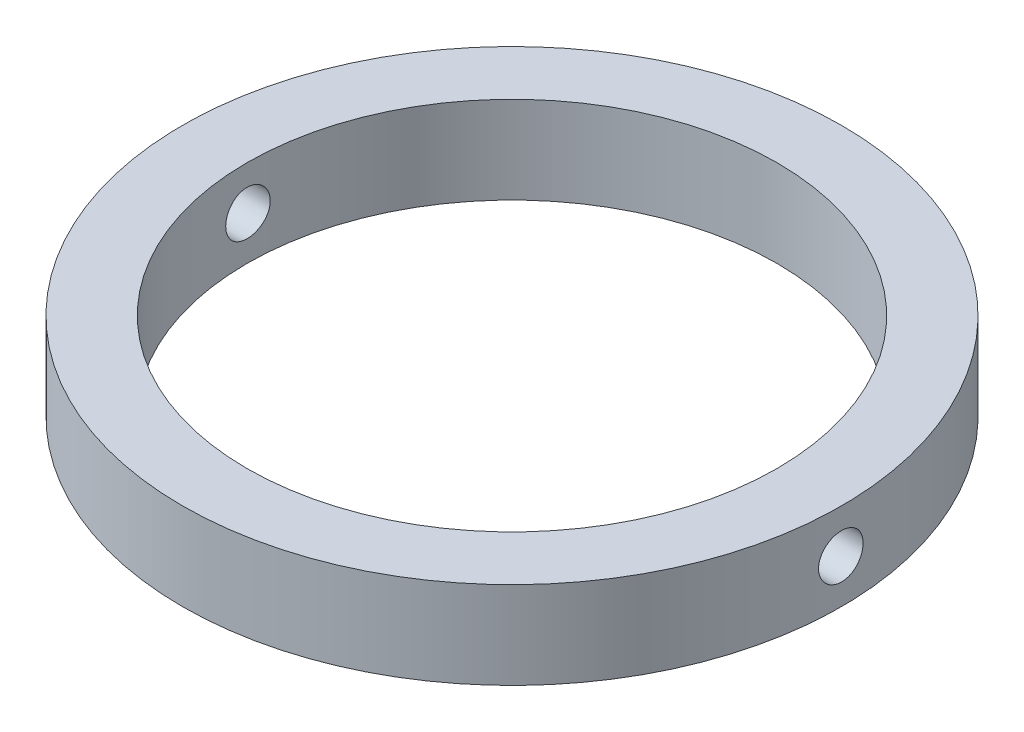
ISO-10303-21;
HEADER;
FILE_DESCRIPTION(('STEP AP214'),'2;1');
FILE_NAME('part.step','',(''),(''),'','','');
FILE_SCHEMA(('AUTOMOTIVE_DESIGN { 1 0 10303 214 1 1 1 1 }'));
ENDSEC;
DATA;
#1=APPLICATION_CONTEXT('core data for automotive mechanical design processes');
#2=APPLICATION_PROTOCOL_DEFINITION('international standard','automotive_design',2000,#1);
#3=PRODUCT_CONTEXT('',#1,'mechanical');
#4=PRODUCT('Part','Part','',(#3));
#5=PRODUCT_RELATED_PRODUCT_CATEGORY('part','',(#4));
#6=PRODUCT_DEFINITION_FORMATION('','',#4);
#7=PRODUCT_DEFINITION_CONTEXT('part definition',#1,'design');
#8=PRODUCT_DEFINITION('design','',#6,#7);
#9=PRODUCT_DEFINITION_SHAPE('','',#8);
#10=(LENGTH_UNIT() NAMED_UNIT(*) SI_UNIT(.MILLI.,.METRE.));
#11=(NAMED_UNIT(*) PLANE_ANGLE_UNIT() SI_UNIT($,.RADIAN.));
#12=(NAMED_UNIT(*) SI_UNIT($,.STERADIAN.) SOLID_ANGLE_UNIT());
#13=UNCERTAINTY_MEASURE_WITH_UNIT(LENGTH_MEASURE(1.E-05),#10,'distance_accuracy_value','');
#14=(GEOMETRIC_REPRESENTATION_CONTEXT(3) GLOBAL_UNCERTAINTY_ASSIGNED_CONTEXT((#13)) GLOBAL_UNIT_ASSIGNED_CONTEXT((#10,
#11,#12)) REPRESENTATION_CONTEXT('',''));
#15=CARTESIAN_POINT('',(0.,0.,0.));
#16=DIRECTION('',(0.,0.,1.));
#17=DIRECTION('',(1.,0.,0.));
#18=AXIS2_PLACEMENT_3D('',#15,#16,#17);
#19=CARTESIAN_POINT('',(0.,10.,0.));
#20=DIRECTION('',(0.,1.,0.));
#21=DIRECTION('',(0.,0.,1.));
#22=AXIS2_PLACEMENT_3D('',#19,#20,#21);
#23=PLANE('',#22);
#24=CARTESIAN_POINT('',(0.,10.,0.));
#25=DIRECTION('',(0.,1.,0.));
#26=DIRECTION('',(0.,0.,1.));
#27=AXIS2_PLACEMENT_3D('',#24,#25,#26);
#28=CIRCLE('',#27,37.75);
#29=CARTESIAN_POINT('',(0.,10.,37.75));
#30=VERTEX_POINT('',#29);
#31=EDGE_CURVE('E10',#30,#30,#28,.T.);
#32=ORIENTED_EDGE('',*,*,#31,.T.);
#33=EDGE_LOOP('',(#32));
#34=FACE_BOUND('',#33,.T.);
#35=CARTESIAN_POINT('',(0.,10.,0.));
#36=DIRECTION('',(0.,1.,0.));
#37=DIRECTION('',(0.,0.,1.));
#38=AXIS2_PLACEMENT_3D('',#35,#36,#37);
#39=CIRCLE('',#38,30.35);
#40=CARTESIAN_POINT('',(0.,10.,30.35));
#41=VERTEX_POINT('',#40);
#42=EDGE_CURVE('E50',#41,#41,#39,.T.);
#43=ORIENTED_EDGE('',*,*,#42,.F.);
#44=EDGE_LOOP('',(#43));
#45=FACE_BOUND('',#44,.T.);
#46=ADVANCED_FACE('F32',(#34,#45),#23,.T.);
#47=CARTESIAN_POINT('',(0.,0.,0.));
#48=DIRECTION('',(0.,1.,0.));
#49=DIRECTION('',(0.,0.,1.));
#50=AXIS2_PLACEMENT_3D('',#47,#48,#49);
#51=PLANE('',#50);
#52=CARTESIAN_POINT('',(0.,0.,0.));
#53=DIRECTION('',(0.,1.,0.));
#54=DIRECTION('',(0.,0.,1.));
#55=AXIS2_PLACEMENT_3D('',#52,#53,#54);
#56=CIRCLE('',#55,37.75);
#57=CARTESIAN_POINT('',(0.,0.,37.75));
#58=VERTEX_POINT('',#57);
#59=EDGE_CURVE('E45',#58,#58,#56,.T.);
#60=ORIENTED_EDGE('',*,*,#59,.F.);
#61=EDGE_LOOP('',(#60));
#62=FACE_BOUND('',#61,.T.);
#63=CARTESIAN_POINT('',(0.,0.,0.));
#64=DIRECTION('',(0.,1.,0.));
#65=DIRECTION('',(0.,0.,1.));
#66=AXIS2_PLACEMENT_3D('',#63,#64,#65);
#67=CIRCLE('',#66,30.35);
#68=CARTESIAN_POINT('',(0.,0.,30.35));
#69=VERTEX_POINT('',#68);
#70=EDGE_CURVE('E53',#69,#69,#67,.T.);
#71=ORIENTED_EDGE('',*,*,#70,.T.);
#72=EDGE_LOOP('',(#71));
#73=FACE_BOUND('',#72,.T.);
#74=ADVANCED_FACE('F86',(#62,#73),#51,.F.);
#75=CARTESIAN_POINT('',(0.,10.,0.));
#76=DIRECTION('',(0.,-1.,0.));
#77=DIRECTION('',(0.,0.,-1.));
#78=AXIS2_PLACEMENT_3D('',#75,#76,#77);
#79=CYLINDRICAL_SURFACE('',#78,37.75);
#80=CARTESIAN_POINT('',(37.6637757002667,5.,2.55));
#81=CARTESIAN_POINT('',(37.6637768514412,5.14305919923894,2.54999371438901));
#82=CARTESIAN_POINT('',(37.6645995452468,5.28621796897454,2.53792074924684));
#83=CARTESIAN_POINT('',(37.6678017240957,5.56858080132352,2.48993357839888));
#84=CARTESIAN_POINT('',(37.6701830107446,5.70778009256848,2.45399178157704));
#85=CARTESIAN_POINT('',(37.6762314266056,5.9780931430584,2.35930557559761));
#86=CARTESIAN_POINT('',(37.6798978661227,6.10921119492061,2.30057339540748));
#87=CARTESIAN_POINT('',(37.6881025959645,6.35969415753618,2.1619938432998));
#88=CARTESIAN_POINT('',(37.6926406894591,6.47906171250711,2.08215123684185));
#89=CARTESIAN_POINT('',(37.7020862698258,6.70289576105521,1.90346624114312));
#90=CARTESIAN_POINT('',(37.7069943116072,6.80733916109374,1.80459495011165));
#91=CARTESIAN_POINT('',(37.7166216274543,6.99816229156432,1.59071927597844));
#92=CARTESIAN_POINT('',(37.72134089356,7.08454126093622,1.47571421349674));
#93=CARTESIAN_POINT('',(37.7300638249697,7.23685597212897,1.23270340039415));
#94=CARTESIAN_POINT('',(37.734066812602,7.30277239718572,1.10468551597517));
#95=CARTESIAN_POINT('',(37.7409002684916,7.4121672511731,0.839368010126296));
#96=CARTESIAN_POINT('',(37.7437307510191,7.45564595318792,0.702068501683859));
#97=CARTESIAN_POINT('',(37.7478964288432,7.51886650872839,0.422309466432688));
#98=CARTESIAN_POINT('',(37.749233920814,7.53864482412016,0.279858214092364));
#99=CARTESIAN_POINT('',(37.7502706617842,7.55401579854028,-0.00634810017443522));
#100=CARTESIAN_POINT('',(37.7499699318478,7.54960876854027,-0.150103145313205));
#101=CARTESIAN_POINT('',(37.7477660257855,7.51676416968068,-0.434589341418162));
#102=CARTESIAN_POINT('',(37.7458654649124,7.48836581929507,-0.575325043319297));
#103=CARTESIAN_POINT('',(37.7406788343848,7.40840559125127,-0.850027457945258));
#104=CARTESIAN_POINT('',(37.7373927554434,7.35684355832979,-0.983994125291389));
#105=CARTESIAN_POINT('',(37.729800508433,7.23197536363481,-1.24148131052604));
#106=CARTESIAN_POINT('',(37.725493509269,7.1586514739826,-1.36499320579769));
#107=CARTESIAN_POINT('',(37.7163439897186,6.99235385163646,-1.59797064593888));
#108=CARTESIAN_POINT('',(37.7115014622592,6.89937985940508,-1.70743600525188));
#109=CARTESIAN_POINT('',(37.7018142937437,6.6961998235691,-1.90944204407408));
#110=CARTESIAN_POINT('',(37.6969696677855,6.58595973159102,-2.00194848150024));
#111=CARTESIAN_POINT('',(37.6878341453951,6.35149595857997,-2.16714663234428));
#112=CARTESIAN_POINT('',(37.6835432492252,6.22727227092249,-2.23983833637517));
#113=CARTESIAN_POINT('',(37.6759998527003,5.96834530239942,-2.36334137679767));
#114=CARTESIAN_POINT('',(37.6727474242279,5.83364129689065,-2.41415119861471));
#115=CARTESIAN_POINT('',(37.6676502272067,5.55758774446423,-2.49242416048339));
#116=CARTESIAN_POINT('',(37.6658054392964,5.41623828898071,-2.51988762165627));
#117=CARTESIAN_POINT('',(37.6637352083677,5.13120512051237,-2.55064546599403));
#118=CARTESIAN_POINT('',(37.6635065740368,4.98752656957951,-2.55398748047305));
#119=CARTESIAN_POINT('',(37.66468609386,4.7016510092864,-2.53653208264845));
#120=CARTESIAN_POINT('',(37.6660942380434,4.55945399090645,-2.51573481739353));
#121=CARTESIAN_POINT('',(37.6703857197025,4.28071308220365,-2.4506308154166));
#122=CARTESIAN_POINT('',(37.6732676766268,4.14416403046466,-2.40634607846611));
#123=CARTESIAN_POINT('',(37.6801808580568,3.88043574596532,-2.29554651460015));
#124=CARTESIAN_POINT('',(37.6842120947333,3.75325661244958,-2.22903145226606));
#125=CARTESIAN_POINT('',(37.6929773107964,3.51165969908585,-2.07553789521472));
#126=CARTESIAN_POINT('',(37.6977123806269,3.39726221225539,-1.98852752273066));
#127=CARTESIAN_POINT('',(37.707347898682,3.18468048703621,-1.79655956861662));
#128=CARTESIAN_POINT('',(37.7122483487893,3.0864964332889,-1.69160178262606));
#129=CARTESIAN_POINT('',(37.7216718051351,2.90896740297482,-1.46651318772246));
#130=CARTESIAN_POINT('',(37.7261941855625,2.8296532760305,-1.34635801772021));
#131=CARTESIAN_POINT('',(37.7343429370187,2.69232675737586,-1.09440767746528));
#132=CARTESIAN_POINT('',(37.737969314325,2.63431421642465,-0.962612588770974));
#133=CARTESIAN_POINT('',(37.743914496441,2.5412911481782,-0.691236381680627));
#134=CARTESIAN_POINT('',(37.7462344053828,2.5062611935278,-0.551661947800892));
#135=CARTESIAN_POINT('',(37.7493096766998,2.46013410918165,-0.268596396519987));
#136=CARTESIAN_POINT('',(37.7500650575376,2.44903669706559,-0.125105325358041));
#137=CARTESIAN_POINT('',(37.7499262117687,2.45109255272986,0.161415258244705));
#138=CARTESIAN_POINT('',(37.7490352661935,2.46419758643241,0.304445120861527));
#139=CARTESIAN_POINT('',(37.7457104413025,2.51418619579494,0.586268391668371));
#140=CARTESIAN_POINT('',(37.7432765593847,2.55106981155464,0.725061792713697));
#141=CARTESIAN_POINT('',(37.7371393172474,2.64755737331943,0.994478579060124));
#142=CARTESIAN_POINT('',(37.7334359771486,2.70716095921927,1.12510209381347));
#143=CARTESIAN_POINT('',(37.7251752965367,2.84739020588123,1.37449480494763));
#144=CARTESIAN_POINT('',(37.7206179762917,2.92801536774233,1.49326428256553));
#145=CARTESIAN_POINT('',(37.7111509254295,3.10817843289298,1.7158228912271));
#146=CARTESIAN_POINT('',(37.7062405507197,3.2077514777727,1.81958354670276));
#147=CARTESIAN_POINT('',(37.6966260920758,3.42293139022573,2.00895430261907));
#148=CARTESIAN_POINT('',(37.691922058801,3.53854216656727,2.09455996536439));
#149=CARTESIAN_POINT('',(37.6832457192277,3.78266751590887,2.24526520360815));
#150=CARTESIAN_POINT('',(37.679274428032,3.91119961448422,2.31033641902929));
#151=CARTESIAN_POINT('',(37.6725260514595,4.17729954159549,2.41789418063371));
#152=CARTESIAN_POINT('',(37.6697475736622,4.31485661736885,2.46040707384341));
#153=CARTESIAN_POINT('',(37.6664246645439,4.54437413866582,2.51063966204028));
#154=CARTESIAN_POINT('',(37.6654357692517,4.63485248898468,2.52538058761948));
#155=CARTESIAN_POINT('',(37.6641109191742,4.81687362505129,2.54506276044881));
#156=CARTESIAN_POINT('',(37.6637749633082,4.90841640903683,2.55000402392037));
#157=CARTESIAN_POINT('',(37.6637757002667,5.,2.55));
#158=B_SPLINE_CURVE_WITH_KNOTS('',3,(#80,#81,#82,#83,#84,#85,#86,#87,#88,#89,#90,#91,#92,#93,
#94,#95,#96,#97,#98,#99,#100,#101,#102,#103,#104,#105,#106,#107,#108,#109,#110,#111,#112,#113,
#114,#115,#116,#117,#118,#119,#120,#121,#122,#123,#124,#125,#126,#127,#128,#129,#130,#131,#132,
#133,#134,#135,#136,#137,#138,#139,#140,#141,#142,#143,#144,#145,#146,#147,#148,#149,#150,#151,
#152,#153,#154,#155,#156,#157),.UNSPECIFIED.,.T.,.F.,(4,2,2,2,2,2,2,2,2,2,2,2,2,2,2,2,2,2,2,2,2,
2,2,2,2,2,2,2,2,2,2,2,2,2,2,2,2,2,4),(0.,0.428843249734375,0.858183084624657,1.28729286025503,
1.71630585138852,2.14597566761514,2.57566358232119,3.00575590008417,3.43584298317204,
3.86526754567849,4.29468658671922,4.7234050141778,5.15212631532571,5.58119782917631,
6.01027501053365,6.44020923074846,6.87014365463929,7.30010783205513,7.7300660953641,
8.15917511051489,8.58828151168598,9.01698669410422,9.44569641664381,9.87507739596272,
10.3044632648102,10.7345463669446,11.1646264558193,11.5943425247084,12.0240535226274,
12.4529090553278,12.8817653112435,13.3106147701889,13.7394540522589,14.1690965703269,
14.5988439868488,15.0291823549478,15.4590169961947,15.7335541807462,16.0080909108546),.UNSPECIFIED.);
#159=CARTESIAN_POINT('',(37.6637757002667,5.,2.55));
#160=VERTEX_POINT('',#159);
#161=EDGE_CURVE('E76',#160,#160,#158,.T.);
#162=ORIENTED_EDGE('',*,*,#161,.T.);
#163=EDGE_LOOP('',(#162));
#164=FACE_BOUND('',#163,.T.);
#165=CARTESIAN_POINT('',(-37.6637757002667,5.,2.55));
#166=CARTESIAN_POINT('',(-37.6637768514412,4.85694080076106,2.54999371438901));
#167=CARTESIAN_POINT('',(-37.6645995452468,4.71378203102546,2.53792074924684));
#168=CARTESIAN_POINT('',(-37.6678017240957,4.43141919867648,2.48993357839888));
#169=CARTESIAN_POINT('',(-37.6701830107446,4.29221990743152,2.45399178157704));
#170=CARTESIAN_POINT('',(-37.6762314266056,4.0219068569416,2.35930557559761));
#171=CARTESIAN_POINT('',(-37.6798978661227,3.89078880507939,2.30057339540748));
#172=CARTESIAN_POINT('',(-37.6881025959645,3.64030584246382,2.1619938432998));
#173=CARTESIAN_POINT('',(-37.6926406894591,3.52093828749289,2.08215123684185));
#174=CARTESIAN_POINT('',(-37.7020862698258,3.29710423894479,1.90346624114312));
#175=CARTESIAN_POINT('',(-37.7069943116072,3.19266083890626,1.80459495011165));
#176=CARTESIAN_POINT('',(-37.7166216274543,3.00183770843568,1.59071927597844));
#177=CARTESIAN_POINT('',(-37.72134089356,2.91545873906378,1.47571421349674));
#178=CARTESIAN_POINT('',(-37.7300638249697,2.76314402787103,1.23270340039416));
#179=CARTESIAN_POINT('',(-37.734066812602,2.69722760281428,1.10468551597517));
#180=CARTESIAN_POINT('',(-37.7409002684916,2.5878327488269,0.839368010126296));
#181=CARTESIAN_POINT('',(-37.7437307510191,2.54435404681208,0.70206850168386));
#182=CARTESIAN_POINT('',(-37.7478964288432,2.48113349127161,0.422309466432689));
#183=CARTESIAN_POINT('',(-37.749233920814,2.46135517587984,0.279858214092365));
#184=CARTESIAN_POINT('',(-37.7502706617842,2.44598420145972,-0.00634810017443487));
#185=CARTESIAN_POINT('',(-37.7499699318478,2.45039123145973,-0.150103145313205));
#186=CARTESIAN_POINT('',(-37.7477660257855,2.48323583031932,-0.434589341418162));
#187=CARTESIAN_POINT('',(-37.7458654649124,2.51163418070493,-0.575325043319297));
#188=CARTESIAN_POINT('',(-37.7406788343848,2.59159440874873,-0.850027457945258));
#189=CARTESIAN_POINT('',(-37.7373927554434,2.64315644167021,-0.983994125291389));
#190=CARTESIAN_POINT('',(-37.729800508433,2.76802463636519,-1.24148131052604));
#191=CARTESIAN_POINT('',(-37.725493509269,2.8413485260174,-1.36499320579769));
#192=CARTESIAN_POINT('',(-37.7163439897186,3.00764614836354,-1.59797064593888));
#193=CARTESIAN_POINT('',(-37.7115014622592,3.10062014059492,-1.70743600525188));
#194=CARTESIAN_POINT('',(-37.7018142937437,3.3038001764309,-1.90944204407408));
#195=CARTESIAN_POINT('',(-37.6969696677855,3.41404026840898,-2.00194848150024));
#196=CARTESIAN_POINT('',(-37.6878341453951,3.64850404142003,-2.16714663234428));
#197=CARTESIAN_POINT('',(-37.6835432492252,3.77272772907751,-2.23983833637517));
#198=CARTESIAN_POINT('',(-37.6759998527003,4.03165469760058,-2.36334137679767));
#199=CARTESIAN_POINT('',(-37.6727474242279,4.16635870310935,-2.41415119861471));
#200=CARTESIAN_POINT('',(-37.6676502272067,4.44241225553577,-2.49242416048339));
#201=CARTESIAN_POINT('',(-37.6658054392964,4.58376171101929,-2.51988762165627));
#202=CARTESIAN_POINT('',(-37.6637352083677,4.86879487948763,-2.55064546599403));
#203=CARTESIAN_POINT('',(-37.6635065740368,5.01247343042049,-2.55398748047305));
#204=CARTESIAN_POINT('',(-37.66468609386,5.2983489907136,-2.53653208264845));
#205=CARTESIAN_POINT('',(-37.6660942380434,5.44054600909355,-2.51573481739353));
#206=CARTESIAN_POINT('',(-37.6703857197025,5.71928691779635,-2.4506308154166));
#207=CARTESIAN_POINT('',(-37.6732676766268,5.85583596953534,-2.40634607846611));
#208=CARTESIAN_POINT('',(-37.6801808580568,6.11956425403468,-2.29554651460014));
#209=CARTESIAN_POINT('',(-37.6842120947333,6.24674338755042,-2.22903145226606));
#210=CARTESIAN_POINT('',(-37.6929773107964,6.48834030091415,-2.07553789521472));
#211=CARTESIAN_POINT('',(-37.6977123806269,6.60273778774461,-1.98852752273066));
#212=CARTESIAN_POINT('',(-37.707347898682,6.81531951296379,-1.79655956861662));
#213=CARTESIAN_POINT('',(-37.7122483487893,6.9135035667111,-1.69160178262606));
#214=CARTESIAN_POINT('',(-37.7216718051351,7.09103259702518,-1.46651318772246));
#215=CARTESIAN_POINT('',(-37.7261941855625,7.1703467239695,-1.34635801772021));
#216=CARTESIAN_POINT('',(-37.7343429370187,7.30767324262414,-1.09440767746528));
#217=CARTESIAN_POINT('',(-37.737969314325,7.36568578357535,-0.962612588770974));
#218=CARTESIAN_POINT('',(-37.743914496441,7.4587088518218,-0.691236381680627));
#219=CARTESIAN_POINT('',(-37.7462344053828,7.4937388064722,-0.551661947800892));
#220=CARTESIAN_POINT('',(-37.7493096766998,7.53986589081835,-0.268596396519987));
#221=CARTESIAN_POINT('',(-37.7500650575376,7.55096330293441,-0.125105325358041));
#222=CARTESIAN_POINT('',(-37.7499262117687,7.54890744727014,0.161415258244705));
#223=CARTESIAN_POINT('',(-37.7490352661935,7.53580241356759,0.304445120861527));
#224=CARTESIAN_POINT('',(-37.7457104413025,7.48581380420505,0.586268391668372));
#225=CARTESIAN_POINT('',(-37.7432765593847,7.44893018844536,0.725061792713697));
#226=CARTESIAN_POINT('',(-37.7371393172474,7.35244262668057,0.994478579060124));
#227=CARTESIAN_POINT('',(-37.7334359771486,7.29283904078073,1.12510209381347));
#228=CARTESIAN_POINT('',(-37.7251752965367,7.15260979411877,1.37449480494763));
#229=CARTESIAN_POINT('',(-37.7206179762917,7.07198463225767,1.49326428256553));
#230=CARTESIAN_POINT('',(-37.7111509254295,6.89182156710702,1.7158228912271));
#231=CARTESIAN_POINT('',(-37.7062405507197,6.7922485222273,1.81958354670276));
#232=CARTESIAN_POINT('',(-37.6966260920758,6.57706860977427,2.00895430261908));
#233=CARTESIAN_POINT('',(-37.691922058801,6.46145783343273,2.09455996536439));
#234=CARTESIAN_POINT('',(-37.6832457192277,6.21733248409113,2.24526520360815));
#235=CARTESIAN_POINT('',(-37.679274428032,6.08880038551578,2.31033641902929));
#236=CARTESIAN_POINT('',(-37.6725260514595,5.82270045840451,2.41789418063371));
#237=CARTESIAN_POINT('',(-37.6697475736622,5.68514338263115,2.46040707384341));
#238=CARTESIAN_POINT('',(-37.6664246645439,5.45562586133419,2.51063966204028));
#239=CARTESIAN_POINT('',(-37.6654357692517,5.36514751101532,2.52538058761948));
#240=CARTESIAN_POINT('',(-37.6641109191742,5.18312637494871,2.54506276044881));
#241=CARTESIAN_POINT('',(-37.6637749633082,5.09158359096317,2.55000402392037));
#242=CARTESIAN_POINT('',(-37.6637757002667,5.,2.55));
#243=B_SPLINE_CURVE_WITH_KNOTS('',3,(#165,#166,#167,#168,#169,#170,#171,#172,#173,#174,#175,
#176,#177,#178,#179,#180,#181,#182,#183,#184,#185,#186,#187,#188,#189,#190,#191,#192,#193,#194,
#195,#196,#197,#198,#199,#200,#201,#202,#203,#204,#205,#206,#207,#208,#209,#210,#211,#212,#213,
#214,#215,#216,#217,#218,#219,#220,#221,#222,#223,#224,#225,#226,#227,#228,#229,#230,#231,#232,
#233,#234,#235,#236,#237,#238,#239,#240,#241,#242),.UNSPECIFIED.,.T.,.F.,(4,2,2,2,2,2,2,2,2,2,2,
2,2,2,2,2,2,2,2,2,2,2,2,2,2,2,2,2,2,2,2,2,2,2,2,2,2,2,4),(0.,0.428843249734374,
0.858183084624657,1.28729286025503,1.71630585138852,2.14597566761513,2.57566358232119,
3.00575590008417,3.43584298317204,3.86526754567849,4.29468658671922,4.7234050141778,
5.15212631532571,5.58119782917631,6.01027501053365,6.44020923074847,6.8701436546393,
7.30010783205513,7.7300660953641,8.15917511051489,8.58828151168599,9.01698669410422,
9.44569641664382,9.87507739596272,10.3044632648102,10.7345463669446,11.1646264558193,
11.5943425247084,12.0240535226274,12.4529090553278,12.8817653112436,13.3106147701889,
13.7394540522589,14.1690965703269,14.5988439868489,15.0291823549479,15.4590169961947,
15.7335541807462,16.0080909108546),.UNSPECIFIED.);
#244=CARTESIAN_POINT('',(-37.6637757002667,5.,2.55));
#245=VERTEX_POINT('',#244);
#246=EDGE_CURVE('E72',#245,#245,#243,.T.);
#247=ORIENTED_EDGE('',*,*,#246,.T.);
#248=EDGE_LOOP('',(#247));
#249=FACE_BOUND('',#248,.T.);
#250=ORIENTED_EDGE('',*,*,#31,.F.);
#251=EDGE_LOOP('',(#250));
#252=FACE_BOUND('',#251,.T.);
#253=ORIENTED_EDGE('',*,*,#59,.T.);
#254=EDGE_LOOP('',(#253));
#255=FACE_BOUND('',#254,.T.);
#256=ADVANCED_FACE('F34',(#164,#249,#252,#255),#79,.T.);
#257=CARTESIAN_POINT('',(0.,10.,0.));
#258=DIRECTION('',(0.,-1.,0.));
#259=DIRECTION('',(0.,0.,-1.));
#260=AXIS2_PLACEMENT_3D('',#257,#258,#259);
#261=CYLINDRICAL_SURFACE('',#260,30.35);
#262=CARTESIAN_POINT('',(30.2426850659792,5.,2.55));
#263=CARTESIAN_POINT('',(30.2426864871879,5.14296313531632,2.5499937566595));
#264=CARTESIAN_POINT('',(30.2437097021962,5.28602349237282,2.53793692908695));
#265=CARTESIAN_POINT('',(30.2476919451726,5.56818560996319,2.49001761370108));
#266=CARTESIAN_POINT('',(30.2506531642659,5.70728270361727,2.45412817985175));
#267=CARTESIAN_POINT('',(30.2581736701567,5.97739081954605,2.35958921280843));
#268=CARTESIAN_POINT('',(30.262732048464,6.10840638900307,2.30095261654219));
#269=CARTESIAN_POINT('',(30.2729321224083,6.35870459256903,2.16260688276825));
#270=CARTESIAN_POINT('',(30.2785735869949,6.47798972089325,2.08290223825853));
#271=CARTESIAN_POINT('',(30.2903206977283,6.70178307667209,1.90445842507727));
#272=CARTESIAN_POINT('',(30.2964273870416,6.80625649761221,1.80567566891172));
#273=CARTESIAN_POINT('',(30.30840732571,6.9971617733568,1.59197196675321));
#274=CARTESIAN_POINT('',(30.3142805648392,7.08359283855015,1.47705031482075));
#275=CARTESIAN_POINT('',(30.3251417461109,7.236075931442,1.23412318749224));
#276=CARTESIAN_POINT('',(30.3301283739941,7.30209781103997,1.10609872464841));
#277=CARTESIAN_POINT('',(30.3386432307757,7.41169556871075,0.840732540009416));
#278=CARTESIAN_POINT('',(30.3421714855767,7.45527184544887,0.703390983747898));
#279=CARTESIAN_POINT('',(30.3473647664752,7.51864114598466,0.423635932779551));
#280=CARTESIAN_POINT('',(30.3490342068905,7.53849052477944,0.281235286682378));
#281=CARTESIAN_POINT('',(30.3503367191374,7.55401679630572,-0.00488553596760831));
#282=CARTESIAN_POINT('',(30.3499698293998,7.54969414522721,-0.148605687566764));
#283=CARTESIAN_POINT('',(30.3472446612942,7.51704513785606,-0.43290369705372));
#284=CARTESIAN_POINT('',(30.3448914105899,7.48877938314119,-0.573488569372764));
#285=CARTESIAN_POINT('',(30.3384639827202,7.40914076607685,-0.84791151923537));
#286=CARTESIAN_POINT('',(30.3343897889514,7.3577676807914,-0.981749531672406));
#287=CARTESIAN_POINT('',(30.3249701664428,7.23330519566196,-1.23907236032364));
#288=CARTESIAN_POINT('',(30.3196231513162,7.16018866719882,-1.36254399448331));
#289=CARTESIAN_POINT('',(30.3082587413614,6.99433450427302,-1.59548528490878));
#290=CARTESIAN_POINT('',(30.3022413327081,6.90159646512844,-1.70495465231148));
#291=CARTESIAN_POINT('',(30.2901904102873,6.69879024672052,-1.90713833056902));
#292=CARTESIAN_POINT('',(30.2841569042056,6.5886694062794,-1.99979982669798));
#293=CARTESIAN_POINT('',(30.272772499085,6.35440700042099,-2.1653293746983));
#294=CARTESIAN_POINT('',(30.2674216006225,6.23026542316649,-2.23819740985856));
#295=CARTESIAN_POINT('',(30.2580072959768,5.97144825313932,-2.36206963540596));
#296=CARTESIAN_POINT('',(30.2539440523748,5.8367713328332,-2.41307106516989));
#297=CARTESIAN_POINT('',(30.247568275135,5.56072424285993,-2.49172313193576));
#298=CARTESIAN_POINT('',(30.2452557040739,5.41935421633653,-2.51937426808649));
#299=CARTESIAN_POINT('',(30.2426491959637,5.13439610123633,-2.5504739324175));
#300=CARTESIAN_POINT('',(30.2423491153376,4.99081610553318,-2.55399612031544));
#301=CARTESIAN_POINT('',(30.2437853483444,4.70510771559932,-2.53693087557157));
#302=CARTESIAN_POINT('',(30.2455216426644,4.56297930761459,-2.51634367158433));
#303=CARTESIAN_POINT('',(30.2508293871406,4.28442018642761,-2.45170545412161));
#304=CARTESIAN_POINT('',(30.2543981471296,4.14798143706127,-2.40768883294673));
#305=CARTESIAN_POINT('',(30.2629664835539,3.88442566360753,-2.29747622075004));
#306=CARTESIAN_POINT('',(30.2679660833204,3.75730879156491,-2.23127986806299));
#307=CARTESIAN_POINT('',(30.2788476615742,3.51566813354671,-2.07840054561045));
#308=CARTESIAN_POINT('',(30.2847317412416,3.40117549192486,-1.99166850097334));
#309=CARTESIAN_POINT('',(30.2967121927521,3.18834813177082,-1.8002506551656));
#310=CARTESIAN_POINT('',(30.3028085683068,3.09001369589554,-1.69556453998828));
#311=CARTESIAN_POINT('',(30.3145450019082,2.9120425794272,-1.47089185502982));
#312=CARTESIAN_POINT('',(30.3201838681905,2.83245376497739,-1.35086729797868));
#313=CARTESIAN_POINT('',(30.3303527463732,2.69456159082774,-1.0991140025233));
#314=CARTESIAN_POINT('',(30.3348827695113,2.63625801540315,-0.96738538275594));
#315=CARTESIAN_POINT('',(30.3423180667177,2.54267350498506,-0.696134605097086));
#316=CARTESIAN_POINT('',(30.3452254271706,2.50736299621359,-0.556622709978667));
#317=CARTESIAN_POINT('',(30.3490962913874,2.4606703033253,-0.273624919036567));
#318=CARTESIAN_POINT('',(30.3500598326148,2.44928765804411,-0.13013909985677));
#319=CARTESIAN_POINT('',(30.3499345478864,2.45077922480926,0.156261736682727));
#320=CARTESIAN_POINT('',(30.3488520326697,2.4635788503952,0.299177151163991));
#321=CARTESIAN_POINT('',(30.3447687477825,2.51291605450937,0.58082089403343));
#322=CARTESIAN_POINT('',(30.341767975542,2.54945366484017,0.719549216811761));
#323=CARTESIAN_POINT('',(30.334184848279,2.64521064653002,0.988885423311928));
#324=CARTESIAN_POINT('',(30.3296025890423,2.70442864422995,1.11949379826935));
#325=CARTESIAN_POINT('',(30.3193690565898,2.84385689240525,1.36892705372945));
#326=CARTESIAN_POINT('',(30.3137177998749,2.9240668188588,1.48775211607492));
#327=CARTESIAN_POINT('',(30.3019597779325,3.10348202923549,1.71062747788546));
#328=CARTESIAN_POINT('',(30.2958517210174,3.20274252497844,1.8146332633759));
#329=CARTESIAN_POINT('',(30.2838795025323,3.41734104074677,2.00455053647791));
#330=CARTESIAN_POINT('',(30.278015400366,3.53268294723289,2.0904576374658));
#331=CARTESIAN_POINT('',(30.2671829831916,3.77639763442149,2.2418573082784));
#332=CARTESIAN_POINT('',(30.2622163898155,3.90479473637205,2.30731081500439));
#333=CARTESIAN_POINT('',(30.253762314337,4.17071091590184,2.41564605370831));
#334=CARTESIAN_POINT('',(30.2502731338152,4.30821930767385,2.45855371792188));
#335=CARTESIAN_POINT('',(30.2460656375332,4.53878145106102,2.50965979840629));
#336=CARTESIAN_POINT('',(30.2448037571632,4.63035266466875,2.52476724356445));
#337=CARTESIAN_POINT('',(30.2431130116623,4.81460228966703,2.54493935517319));
#338=CARTESIAN_POINT('',(30.2426841442486,4.90728069802295,2.55000404914296));
#339=CARTESIAN_POINT('',(30.2426850659792,5.,2.55));
#340=B_SPLINE_CURVE_WITH_KNOTS('',3,(#262,#263,#264,#265,#266,#267,#268,#269,#270,#271,#272,
#273,#274,#275,#276,#277,#278,#279,#280,#281,#282,#283,#284,#285,#286,#287,#288,#289,#290,#291,
#292,#293,#294,#295,#296,#297,#298,#299,#300,#301,#302,#303,#304,#305,#306,#307,#308,#309,#310,
#311,#312,#313,#314,#315,#316,#317,#318,#319,#320,#321,#322,#323,#324,#325,#326,#327,#328,#329,
#330,#331,#332,#333,#334,#335,#336,#337,#338,#339),.UNSPECIFIED.,.T.,.F.,(4,2,2,2,2,2,2,2,2,2,2,
2,2,2,2,2,2,2,2,2,2,2,2,2,2,2,2,2,2,2,2,2,2,2,2,2,2,2,4),(0.,0.42855086801031,0.857587098523167,
1.28637968138142,1.71508089307919,2.14477339341604,2.57448469500487,3.0048277585637,
3.4351631783643,3.86447444205657,4.29377760353974,4.72199740597297,5.15022133989394,
5.57898181327532,6.00775113044712,6.43784525568501,6.86793974403867,7.29808851514117,
7.72822809091271,8.1570539693635,8.58587578084304,9.01406984897827,9.44227089963438,
9.87150575354421,10.3007481152981,10.7310749260334,11.1613973753088,11.5911652430441,
12.0209248277396,12.449361049288,12.8777978448276,13.3062086957898,13.7346129343879,
14.1642780406908,14.5940471665037,15.0246321359842,15.4547207563414,15.7326598637762,
16.0105982095998),.UNSPECIFIED.);
#341=CARTESIAN_POINT('',(30.2426850659792,5.,2.55));
#342=VERTEX_POINT('',#341);
#343=EDGE_CURVE('E37',#342,#342,#340,.T.);
#344=ORIENTED_EDGE('',*,*,#343,.F.);
#345=EDGE_LOOP('',(#344));
#346=FACE_BOUND('',#345,.T.);
#347=CARTESIAN_POINT('',(-30.2426850659792,5.,2.55));
#348=CARTESIAN_POINT('',(-30.2426864871879,4.85703686468368,2.5499937566595));
#349=CARTESIAN_POINT('',(-30.2437097021962,4.71397650762718,2.53793692908695));
#350=CARTESIAN_POINT('',(-30.2476919451726,4.43181439003681,2.49001761370108));
#351=CARTESIAN_POINT('',(-30.2506531642659,4.29271729638273,2.45412817985175));
#352=CARTESIAN_POINT('',(-30.2581736701567,4.02260918045395,2.35958921280843));
#353=CARTESIAN_POINT('',(-30.262732048464,3.89159361099693,2.30095261654219));
#354=CARTESIAN_POINT('',(-30.2729321224083,3.64129540743097,2.16260688276825));
#355=CARTESIAN_POINT('',(-30.2785735869949,3.52201027910675,2.08290223825854));
#356=CARTESIAN_POINT('',(-30.2903206977283,3.29821692332791,1.90445842507727));
#357=CARTESIAN_POINT('',(-30.2964273870416,3.19374350238779,1.80567566891172));
#358=CARTESIAN_POINT('',(-30.30840732571,3.0028382266432,1.59197196675321));
#359=CARTESIAN_POINT('',(-30.3142805648392,2.91640716144985,1.47705031482075));
#360=CARTESIAN_POINT('',(-30.3251417461109,2.763924068558,1.23412318749224));
#361=CARTESIAN_POINT('',(-30.3301283739941,2.69790218896003,1.10609872464841));
#362=CARTESIAN_POINT('',(-30.3386432307757,2.58830443128924,0.840732540009415));
#363=CARTESIAN_POINT('',(-30.3421714855767,2.54472815455113,0.703390983747898));
#364=CARTESIAN_POINT('',(-30.3473647664752,2.48135885401534,0.42363593277955));
#365=CARTESIAN_POINT('',(-30.3490342068905,2.46150947522056,0.281235286682377));
#366=CARTESIAN_POINT('',(-30.3503367191374,2.44598320369428,-0.00488553596760894));
#367=CARTESIAN_POINT('',(-30.3499698293998,2.45030585477279,-0.148605687566765));
#368=CARTESIAN_POINT('',(-30.3472446612942,2.48295486214394,-0.432903697053721));
#369=CARTESIAN_POINT('',(-30.3448914105899,2.51122061685881,-0.573488569372764));
#370=CARTESIAN_POINT('',(-30.3384639827202,2.59085923392315,-0.847911519235371));
#371=CARTESIAN_POINT('',(-30.3343897889514,2.6422323192086,-0.981749531672407));
#372=CARTESIAN_POINT('',(-30.3249701664428,2.76669480433804,-1.23907236032364));
#373=CARTESIAN_POINT('',(-30.3196231513162,2.83981133280119,-1.36254399448331));
#374=CARTESIAN_POINT('',(-30.3082587413614,3.00566549572698,-1.59548528490878));
#375=CARTESIAN_POINT('',(-30.3022413327081,3.09840353487156,-1.70495465231148));
#376=CARTESIAN_POINT('',(-30.2901904102873,3.30120975327948,-1.90713833056902));
#377=CARTESIAN_POINT('',(-30.2841569042056,3.4113305937206,-1.99979982669798));
#378=CARTESIAN_POINT('',(-30.272772499085,3.64559299957901,-2.1653293746983));
#379=CARTESIAN_POINT('',(-30.2674216006225,3.76973457683351,-2.23819740985856));
#380=CARTESIAN_POINT('',(-30.2580072959768,4.02855174686068,-2.36206963540596));
#381=CARTESIAN_POINT('',(-30.2539440523748,4.1632286671668,-2.41307106516989));
#382=CARTESIAN_POINT('',(-30.247568275135,4.43927575714007,-2.49172313193576));
#383=CARTESIAN_POINT('',(-30.2452557040739,4.58064578366347,-2.51937426808649));
#384=CARTESIAN_POINT('',(-30.2426491959637,4.86560389876367,-2.5504739324175));
#385=CARTESIAN_POINT('',(-30.2423491153376,5.00918389446683,-2.55399612031544));
#386=CARTESIAN_POINT('',(-30.2437853483444,5.29489228440068,-2.53693087557157));
#387=CARTESIAN_POINT('',(-30.2455216426644,5.43702069238541,-2.51634367158433));
#388=CARTESIAN_POINT('',(-30.2508293871406,5.7155798135724,-2.45170545412161));
#389=CARTESIAN_POINT('',(-30.2543981471296,5.85201856293873,-2.40768883294673));
#390=CARTESIAN_POINT('',(-30.2629664835539,6.11557433639247,-2.29747622075004));
#391=CARTESIAN_POINT('',(-30.2679660833204,6.24269120843509,-2.23127986806299));
#392=CARTESIAN_POINT('',(-30.2788476615742,6.48433186645329,-2.07840054561045));
#393=CARTESIAN_POINT('',(-30.2847317412416,6.59882450807514,-1.99166850097334));
#394=CARTESIAN_POINT('',(-30.2967121927521,6.81165186822918,-1.8002506551656));
#395=CARTESIAN_POINT('',(-30.3028085683068,6.90998630410446,-1.69556453998828));
#396=CARTESIAN_POINT('',(-30.3145450019082,7.0879574205728,-1.47089185502982));
#397=CARTESIAN_POINT('',(-30.3201838681905,7.16754623502261,-1.35086729797868));
#398=CARTESIAN_POINT('',(-30.3303527463732,7.30543840917226,-1.0991140025233));
#399=CARTESIAN_POINT('',(-30.3348827695113,7.36374198459685,-0.967385382755939));
#400=CARTESIAN_POINT('',(-30.3423180667177,7.45732649501494,-0.696134605097085));
#401=CARTESIAN_POINT('',(-30.3452254271706,7.49263700378641,-0.556622709978666));
#402=CARTESIAN_POINT('',(-30.3490962913874,7.5393296966747,-0.273624919036566));
#403=CARTESIAN_POINT('',(-30.3500598326148,7.55071234195589,-0.130139099856769));
#404=CARTESIAN_POINT('',(-30.3499345478864,7.54922077519074,0.156261736682728));
#405=CARTESIAN_POINT('',(-30.3488520326697,7.5364211496048,0.299177151163992));
#406=CARTESIAN_POINT('',(-30.3447687477825,7.48708394549063,0.580820894033431));
#407=CARTESIAN_POINT('',(-30.341767975542,7.45054633515983,0.719549216811762));
#408=CARTESIAN_POINT('',(-30.334184848279,7.35478935346998,0.988885423311928));
#409=CARTESIAN_POINT('',(-30.3296025890423,7.29557135577005,1.11949379826935));
#410=CARTESIAN_POINT('',(-30.3193690565898,7.15614310759475,1.36892705372945));
#411=CARTESIAN_POINT('',(-30.3137177998749,7.0759331811412,1.48775211607492));
#412=CARTESIAN_POINT('',(-30.3019597779325,6.89651797076451,1.71062747788546));
#413=CARTESIAN_POINT('',(-30.2958517210174,6.79725747502156,1.8146332633759));
#414=CARTESIAN_POINT('',(-30.2838795025323,6.58265895925323,2.00455053647791));
#415=CARTESIAN_POINT('',(-30.278015400366,6.46731705276711,2.0904576374658));
#416=CARTESIAN_POINT('',(-30.2671829831916,6.22360236557851,2.2418573082784));
#417=CARTESIAN_POINT('',(-30.2622163898155,6.09520526362796,2.30731081500439));
#418=CARTESIAN_POINT('',(-30.253762314337,5.82928908409816,2.41564605370831));
#419=CARTESIAN_POINT('',(-30.2502731338152,5.69178069232615,2.45855371792188));
#420=CARTESIAN_POINT('',(-30.2460656375332,5.46121854893898,2.50965979840629));
#421=CARTESIAN_POINT('',(-30.2448037571632,5.36964733533125,2.52476724356445));
#422=CARTESIAN_POINT('',(-30.2431130116623,5.18539771033296,2.54493935517319));
#423=CARTESIAN_POINT('',(-30.2426841442486,5.09271930197705,2.55000404914296));
#424=CARTESIAN_POINT('',(-30.2426850659792,5.,2.55));
#425=B_SPLINE_CURVE_WITH_KNOTS('',3,(#347,#348,#349,#350,#351,#352,#353,#354,#355,#356,#357,
#358,#359,#360,#361,#362,#363,#364,#365,#366,#367,#368,#369,#370,#371,#372,#373,#374,#375,#376,
#377,#378,#379,#380,#381,#382,#383,#384,#385,#386,#387,#388,#389,#390,#391,#392,#393,#394,#395,
#396,#397,#398,#399,#400,#401,#402,#403,#404,#405,#406,#407,#408,#409,#410,#411,#412,#413,#414,
#415,#416,#417,#418,#419,#420,#421,#422,#423,#424),.UNSPECIFIED.,.T.,.F.,(4,2,2,2,2,2,2,2,2,2,2,
2,2,2,2,2,2,2,2,2,2,2,2,2,2,2,2,2,2,2,2,2,2,2,2,2,2,2,4),(0.,0.42855086801031,0.857587098523167,
1.28637968138142,1.71508089307919,2.14477339341604,2.57448469500487,3.0048277585637,
3.4351631783643,3.86447444205657,4.29377760353974,4.72199740597297,5.15022133989395,
5.57898181327532,6.00775113044712,6.43784525568501,6.86793974403867,7.29808851514117,
7.72822809091271,8.1570539693635,8.58587578084304,9.01406984897827,9.44227089963439,
9.87150575354421,10.3007481152981,10.7310749260334,11.1613973753088,11.5911652430441,
12.0209248277396,12.449361049288,12.8777978448276,13.3062086957898,13.7346129343879,
14.1642780406908,14.5940471665037,15.0246321359842,15.4547207563414,15.7326598637762,
16.0105982095998),.UNSPECIFIED.);
#426=CARTESIAN_POINT('',(-30.2426850659792,5.,2.55));
#427=VERTEX_POINT('',#426);
#428=EDGE_CURVE('E55',#427,#427,#425,.T.);
#429=ORIENTED_EDGE('',*,*,#428,.F.);
#430=EDGE_LOOP('',(#429));
#431=FACE_BOUND('',#430,.T.);
#432=ORIENTED_EDGE('',*,*,#42,.T.);
#433=EDGE_LOOP('',(#432));
#434=FACE_BOUND('',#433,.T.);
#435=ORIENTED_EDGE('',*,*,#70,.F.);
#436=EDGE_LOOP('',(#435));
#437=FACE_BOUND('',#436,.T.);
#438=ADVANCED_FACE('F59',(#346,#431,#434,#437),#261,.F.);
#439=CARTESIAN_POINT('',(55.25,5.,0.));
#440=DIRECTION('',(-1.,0.,0.));
#441=DIRECTION('',(0.,0.,1.));
#442=AXIS2_PLACEMENT_3D('',#439,#440,#441);
#443=CYLINDRICAL_SURFACE('',#442,2.55);
#444=ORIENTED_EDGE('',*,*,#428,.T.);
#445=EDGE_LOOP('',(#444));
#446=FACE_BOUND('',#445,.T.);
#447=ORIENTED_EDGE('',*,*,#246,.F.);
#448=EDGE_LOOP('',(#447));
#449=FACE_BOUND('',#448,.T.);
#450=ADVANCED_FACE('F65',(#446,#449),#443,.F.);
#451=ORIENTED_EDGE('',*,*,#343,.T.);
#452=EDGE_LOOP('',(#451));
#453=FACE_BOUND('',#452,.T.);
#454=ORIENTED_EDGE('',*,*,#161,.F.);
#455=EDGE_LOOP('',(#454));
#456=FACE_BOUND('',#455,.T.);
#457=ADVANCED_FACE('F62',(#453,#456),#443,.F.);
#458=CLOSED_SHELL('',(#46,#74,#256,#438,#450,#457));
#459=MANIFOLD_SOLID_BREP('B2',#458);
#460=ADVANCED_BREP_SHAPE_REPRESENTATION('',(#18,#459),#14);
#461=SHAPE_DEFINITION_REPRESENTATION(#9,#460);
ENDSEC;
END-ISO-10303-21;
